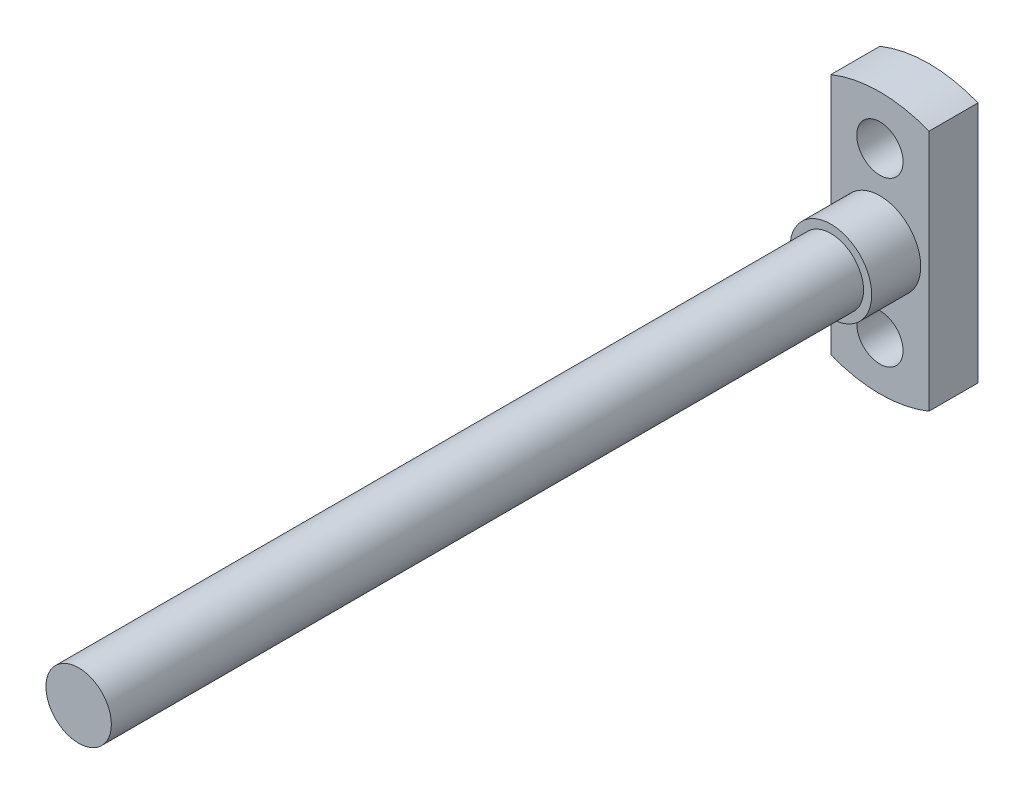
ISO-10303-21;
HEADER;
FILE_DESCRIPTION(('STEP AP214'),'2;1');
FILE_NAME('part.step','',(''),(''),'','','');
FILE_SCHEMA(('AUTOMOTIVE_DESIGN { 1 0 10303 214 1 1 1 1 }'));
ENDSEC;
DATA;
#1=APPLICATION_CONTEXT('core data for automotive mechanical design processes');
#2=APPLICATION_PROTOCOL_DEFINITION('international standard','automotive_design',2000,#1);
#3=PRODUCT_CONTEXT('',#1,'mechanical');
#4=PRODUCT('Part','Part','',(#3));
#5=PRODUCT_RELATED_PRODUCT_CATEGORY('part','',(#4));
#6=PRODUCT_DEFINITION_FORMATION('','',#4);
#7=PRODUCT_DEFINITION_CONTEXT('part definition',#1,'design');
#8=PRODUCT_DEFINITION('design','',#6,#7);
#9=PRODUCT_DEFINITION_SHAPE('','',#8);
#10=(LENGTH_UNIT() NAMED_UNIT(*) SI_UNIT(.MILLI.,.METRE.));
#11=(NAMED_UNIT(*) PLANE_ANGLE_UNIT() SI_UNIT($,.RADIAN.));
#12=(NAMED_UNIT(*) SI_UNIT($,.STERADIAN.) SOLID_ANGLE_UNIT());
#13=UNCERTAINTY_MEASURE_WITH_UNIT(LENGTH_MEASURE(1.E-05),#10,'distance_accuracy_value','');
#14=(GEOMETRIC_REPRESENTATION_CONTEXT(3) GLOBAL_UNCERTAINTY_ASSIGNED_CONTEXT((#13)) GLOBAL_UNIT_ASSIGNED_CONTEXT((#10,
#11,#12)) REPRESENTATION_CONTEXT('',''));
#15=CARTESIAN_POINT('',(0.,0.,0.));
#16=DIRECTION('',(0.,0.,1.));
#17=DIRECTION('',(1.,0.,0.));
#18=AXIS2_PLACEMENT_3D('',#15,#16,#17);
#19=CARTESIAN_POINT('',(4.7625,11.7732150982644,9.525));
#20=DIRECTION('',(0.,0.,1.));
#21=DIRECTION('',(1.,0.,0.));
#22=AXIS2_PLACEMENT_3D('',#19,#20,#21);
#23=PLANE('',#22);
#24=CARTESIAN_POINT('',(4.7625,11.7732150982644,9.525));
#25=DIRECTION('',(0.,0.,1.));
#26=DIRECTION('',(1.,0.,0.));
#27=AXIS2_PLACEMENT_3D('',#24,#25,#26);
#28=CIRCLE('',#27,3.96875);
#29=CARTESIAN_POINT('',(0.793749999999997,11.7732150982644,9.525));
#30=VERTEX_POINT('',#29);
#31=EDGE_CURVE('E104',#30,#30,#28,.T.);
#32=ORIENTED_EDGE('',*,*,#31,.T.);
#33=EDGE_LOOP('',(#32));
#34=FACE_BOUND('',#33,.T.);
#35=CARTESIAN_POINT('',(4.7625,11.7732150982644,9.525));
#36=DIRECTION('',(0.,0.,1.));
#37=DIRECTION('',(1.,0.,0.));
#38=AXIS2_PLACEMENT_3D('',#35,#36,#37);
#39=CIRCLE('',#38,3.175);
#40=CARTESIAN_POINT('',(7.9375,11.7732150982644,9.525));
#41=VERTEX_POINT('',#40);
#42=EDGE_CURVE('E170',#41,#41,#39,.T.);
#43=ORIENTED_EDGE('',*,*,#42,.F.);
#44=EDGE_LOOP('',(#43));
#45=FACE_BOUND('',#44,.T.);
#46=ADVANCED_FACE('F33',(#34,#45),#23,.T.);
#47=CARTESIAN_POINT('',(4.7625,11.7732150982644,4.7625));
#48=DIRECTION('',(0.,0.,-1.));
#49=DIRECTION('',(-1.,0.,0.));
#50=AXIS2_PLACEMENT_3D('',#47,#48,#49);
#51=PLANE('',#50);
#52=CARTESIAN_POINT('',(4.7625,3.83571509826437,4.7625));
#53=DIRECTION('',(0.,0.,1.));
#54=DIRECTION('',(1.,0.,0.));
#55=AXIS2_PLACEMENT_3D('',#52,#53,#54);
#56=CIRCLE('',#55,2.24789999999999);
#57=CARTESIAN_POINT('',(7.01039999999999,3.83571509826437,4.7625));
#58=VERTEX_POINT('',#57);
#59=EDGE_CURVE('E160',#58,#58,#56,.T.);
#60=ORIENTED_EDGE('',*,*,#59,.F.);
#61=EDGE_LOOP('',(#60));
#62=FACE_BOUND('',#61,.T.);
#63=CARTESIAN_POINT('',(4.7625,19.7107150982644,4.7625));
#64=DIRECTION('',(0.,0.,1.));
#65=DIRECTION('',(1.,0.,0.));
#66=AXIS2_PLACEMENT_3D('',#63,#64,#65);
#67=CIRCLE('',#66,2.24789999999999);
#68=CARTESIAN_POINT('',(7.01039999999999,19.7107150982644,4.7625));
#69=VERTEX_POINT('',#68);
#70=EDGE_CURVE('E162',#69,#69,#67,.T.);
#71=ORIENTED_EDGE('',*,*,#70,.F.);
#72=EDGE_LOOP('',(#71));
#73=FACE_BOUND('',#72,.T.);
#74=CARTESIAN_POINT('',(4.7625,11.7732150982644,4.7625));
#75=DIRECTION('',(0.,0.,1.));
#76=DIRECTION('',(-1.,0.,0.));
#77=AXIS2_PLACEMENT_3D('',#74,#75,#76);
#78=CIRCLE('',#77,12.7);
#79=CARTESIAN_POINT('',(0.,0.,4.7625));
#80=VERTEX_POINT('',#79);
#81=CARTESIAN_POINT('',(9.525,0.,4.7625));
#82=VERTEX_POINT('',#81);
#83=EDGE_CURVE('E87',#80,#82,#78,.T.);
#84=ORIENTED_EDGE('',*,*,#83,.T.);
#85=DIRECTION('',(0.,1.,0.));
#86=VECTOR('',#85,1.);
#87=CARTESIAN_POINT('',(9.525,0.,4.7625));
#88=LINE('',#87,#86);
#89=CARTESIAN_POINT('',(9.525,23.5464301965287,4.7625));
#90=VERTEX_POINT('',#89);
#91=EDGE_CURVE('E81',#82,#90,#88,.T.);
#92=ORIENTED_EDGE('',*,*,#91,.T.);
#93=CARTESIAN_POINT('',(4.7625,11.7732150982644,4.7625));
#94=DIRECTION('',(0.,0.,1.));
#95=DIRECTION('',(-1.,0.,0.));
#96=AXIS2_PLACEMENT_3D('',#93,#94,#95);
#97=CIRCLE('',#96,12.7);
#98=CARTESIAN_POINT('',(0.,23.5464301965287,4.7625));
#99=VERTEX_POINT('',#98);
#100=EDGE_CURVE('E85',#90,#99,#97,.T.);
#101=ORIENTED_EDGE('',*,*,#100,.T.);
#102=DIRECTION('',(0.,-1.,0.));
#103=VECTOR('',#102,1.);
#104=CARTESIAN_POINT('',(0.,0.,4.7625));
#105=LINE('',#104,#103);
#106=EDGE_CURVE('E50',#99,#80,#105,.T.);
#107=ORIENTED_EDGE('',*,*,#106,.T.);
#108=EDGE_LOOP('',(#84,#92,#101,#107));
#109=FACE_BOUND('',#108,.T.);
#110=CARTESIAN_POINT('',(4.7625,11.7732150982644,4.7625));
#111=DIRECTION('',(0.,0.,-1.));
#112=DIRECTION('',(-1.,0.,0.));
#113=AXIS2_PLACEMENT_3D('',#110,#111,#112);
#114=CIRCLE('',#113,3.96875);
#115=CARTESIAN_POINT('',(0.793749999999997,11.7732150982644,4.7625));
#116=VERTEX_POINT('',#115);
#117=EDGE_CURVE('E11',#116,#116,#114,.F.);
#118=ORIENTED_EDGE('',*,*,#117,.F.);
#119=EDGE_LOOP('',(#118));
#120=FACE_BOUND('',#119,.T.);
#121=ADVANCED_FACE('F82',(#62,#73,#109,#120),#51,.F.);
#122=CARTESIAN_POINT('',(4.7625,11.7732150982644,4.7625));
#123=DIRECTION('',(0.,0.,-1.));
#124=DIRECTION('',(-1.,0.,0.));
#125=AXIS2_PLACEMENT_3D('',#122,#123,#124);
#126=CYLINDRICAL_SURFACE('',#125,12.7);
#127=CARTESIAN_POINT('',(4.7625,11.7732150982644,0.));
#128=DIRECTION('',(0.,0.,1.));
#129=DIRECTION('',(-1.,0.,0.));
#130=AXIS2_PLACEMENT_3D('',#127,#128,#129);
#131=CIRCLE('',#130,12.7);
#132=CARTESIAN_POINT('',(0.,0.,0.));
#133=VERTEX_POINT('',#132);
#134=CARTESIAN_POINT('',(9.525,0.,0.));
#135=VERTEX_POINT('',#134);
#136=EDGE_CURVE('E101',#133,#135,#131,.T.);
#137=ORIENTED_EDGE('',*,*,#136,.T.);
#138=DIRECTION('',(0.,0.,-1.));
#139=VECTOR('',#138,1.);
#140=CARTESIAN_POINT('',(9.525,0.,4.7625));
#141=LINE('',#140,#139);
#142=EDGE_CURVE('E42',#82,#135,#141,.T.);
#143=ORIENTED_EDGE('',*,*,#142,.F.);
#144=ORIENTED_EDGE('',*,*,#83,.F.);
#145=DIRECTION('',(0.,0.,-1.));
#146=VECTOR('',#145,1.);
#147=CARTESIAN_POINT('',(0.,0.,4.7625));
#148=LINE('',#147,#146);
#149=EDGE_CURVE('E97',#80,#133,#148,.T.);
#150=ORIENTED_EDGE('',*,*,#149,.T.);
#151=EDGE_LOOP('',(#137,#143,#144,#150));
#152=FACE_BOUND('',#151,.T.);
#153=ADVANCED_FACE('F35',(#152),#126,.T.);
#154=CARTESIAN_POINT('',(9.525,0.,4.7625));
#155=DIRECTION('',(-1.,0.,0.));
#156=DIRECTION('',(0.,-1.,0.));
#157=AXIS2_PLACEMENT_3D('',#154,#155,#156);
#158=PLANE('',#157);
#159=DIRECTION('',(0.,1.,0.));
#160=VECTOR('',#159,1.);
#161=CARTESIAN_POINT('',(9.525,0.,0.));
#162=LINE('',#161,#160);
#163=CARTESIAN_POINT('',(9.525,23.5464301965287,0.));
#164=VERTEX_POINT('',#163);
#165=EDGE_CURVE('E92',#135,#164,#162,.T.);
#166=ORIENTED_EDGE('',*,*,#165,.T.);
#167=DIRECTION('',(0.,0.,-1.));
#168=VECTOR('',#167,1.);
#169=CARTESIAN_POINT('',(9.525,23.5464301965287,4.7625));
#170=LINE('',#169,#168);
#171=EDGE_CURVE('E90',#90,#164,#170,.T.);
#172=ORIENTED_EDGE('',*,*,#171,.F.);
#173=ORIENTED_EDGE('',*,*,#91,.F.);
#174=ORIENTED_EDGE('',*,*,#142,.T.);
#175=EDGE_LOOP('',(#166,#172,#173,#174));
#176=FACE_BOUND('',#175,.T.);
#177=ADVANCED_FACE('F91',(#176),#158,.F.);
#178=CARTESIAN_POINT('',(4.7625,11.7732150982644,4.7625));
#179=DIRECTION('',(0.,0.,-1.));
#180=DIRECTION('',(-1.,0.,0.));
#181=AXIS2_PLACEMENT_3D('',#178,#179,#180);
#182=CYLINDRICAL_SURFACE('',#181,12.7);
#183=CARTESIAN_POINT('',(4.7625,11.7732150982644,0.));
#184=DIRECTION('',(0.,0.,1.));
#185=DIRECTION('',(-1.,0.,0.));
#186=AXIS2_PLACEMENT_3D('',#183,#184,#185);
#187=CIRCLE('',#186,12.7);
#188=CARTESIAN_POINT('',(0.,23.5464301965287,0.));
#189=VERTEX_POINT('',#188);
#190=EDGE_CURVE('E67',#164,#189,#187,.T.);
#191=ORIENTED_EDGE('',*,*,#190,.T.);
#192=DIRECTION('',(0.,0.,-1.));
#193=VECTOR('',#192,1.);
#194=CARTESIAN_POINT('',(0.,23.5464301965287,4.7625));
#195=LINE('',#194,#193);
#196=EDGE_CURVE('E93',#99,#189,#195,.T.);
#197=ORIENTED_EDGE('',*,*,#196,.F.);
#198=ORIENTED_EDGE('',*,*,#100,.F.);
#199=ORIENTED_EDGE('',*,*,#171,.T.);
#200=EDGE_LOOP('',(#191,#197,#198,#199));
#201=FACE_BOUND('',#200,.T.);
#202=ADVANCED_FACE('F95',(#201),#182,.T.);
#203=CARTESIAN_POINT('',(0.,0.,4.7625));
#204=DIRECTION('',(1.,0.,0.));
#205=DIRECTION('',(0.,0.,-1.));
#206=AXIS2_PLACEMENT_3D('',#203,#204,#205);
#207=PLANE('',#206);
#208=DIRECTION('',(0.,-1.,0.));
#209=VECTOR('',#208,1.);
#210=CARTESIAN_POINT('',(0.,0.,0.));
#211=LINE('',#210,#209);
#212=EDGE_CURVE('E73',#189,#133,#211,.T.);
#213=ORIENTED_EDGE('',*,*,#212,.T.);
#214=ORIENTED_EDGE('',*,*,#149,.F.);
#215=ORIENTED_EDGE('',*,*,#106,.F.);
#216=ORIENTED_EDGE('',*,*,#196,.T.);
#217=EDGE_LOOP('',(#213,#214,#215,#216));
#218=FACE_BOUND('',#217,.T.);
#219=ADVANCED_FACE('F115',(#218),#207,.F.);
#220=CARTESIAN_POINT('',(4.7625,11.7732150982644,0.));
#221=DIRECTION('',(0.,0.,-1.));
#222=DIRECTION('',(-1.,0.,0.));
#223=AXIS2_PLACEMENT_3D('',#220,#221,#222);
#224=PLANE('',#223);
#225=CARTESIAN_POINT('',(4.7625,3.83571509826437,0.));
#226=DIRECTION('',(0.,0.,1.));
#227=DIRECTION('',(1.,0.,0.));
#228=AXIS2_PLACEMENT_3D('',#225,#226,#227);
#229=CIRCLE('',#228,2.2479);
#230=CARTESIAN_POINT('',(7.0104,3.83571509826437,0.));
#231=VERTEX_POINT('',#230);
#232=EDGE_CURVE('E157',#231,#231,#229,.T.);
#233=ORIENTED_EDGE('',*,*,#232,.T.);
#234=EDGE_LOOP('',(#233));
#235=FACE_BOUND('',#234,.T.);
#236=CARTESIAN_POINT('',(4.7625,19.7107150982644,0.));
#237=DIRECTION('',(0.,0.,1.));
#238=DIRECTION('',(1.,0.,0.));
#239=AXIS2_PLACEMENT_3D('',#236,#237,#238);
#240=CIRCLE('',#239,2.2479);
#241=CARTESIAN_POINT('',(7.0104,19.7107150982644,0.));
#242=VERTEX_POINT('',#241);
#243=EDGE_CURVE('E167',#242,#242,#240,.T.);
#244=ORIENTED_EDGE('',*,*,#243,.T.);
#245=EDGE_LOOP('',(#244));
#246=FACE_BOUND('',#245,.T.);
#247=ORIENTED_EDGE('',*,*,#136,.F.);
#248=ORIENTED_EDGE('',*,*,#212,.F.);
#249=ORIENTED_EDGE('',*,*,#190,.F.);
#250=ORIENTED_EDGE('',*,*,#165,.F.);
#251=EDGE_LOOP('',(#247,#248,#249,#250));
#252=FACE_BOUND('',#251,.T.);
#253=ADVANCED_FACE('F112',(#235,#246,#252),#224,.T.);
#254=CARTESIAN_POINT('',(4.7625,11.7732150982644,9.525));
#255=DIRECTION('',(0.,0.,-1.));
#256=DIRECTION('',(-1.,0.,0.));
#257=AXIS2_PLACEMENT_3D('',#254,#255,#256);
#258=CYLINDRICAL_SURFACE('',#257,3.96875);
#259=CARTESIAN_POINT('',(0.793749999999997,11.7732150982644,9.525));
#260=CARTESIAN_POINT('',(0.793749999999997,11.7732150982644,9.475390625));
#261=CARTESIAN_POINT('',(0.793749999999997,11.7732150982644,9.42578125));
#262=CARTESIAN_POINT('',(0.793749999999997,11.7732150982644,9.3265625));
#263=CARTESIAN_POINT('',(0.793749999999997,11.7732150982644,9.276953125));
#264=CARTESIAN_POINT('',(0.793749999999997,11.7732150982644,9.177734375));
#265=CARTESIAN_POINT('',(0.793749999999997,11.7732150982644,9.128125));
#266=CARTESIAN_POINT('',(0.793749999999997,11.7732150982644,9.02890625));
#267=CARTESIAN_POINT('',(0.793749999999997,11.7732150982644,8.979296875));
#268=CARTESIAN_POINT('',(0.793749999999997,11.7732150982644,8.880078125));
#269=CARTESIAN_POINT('',(0.793749999999997,11.7732150982644,8.83046875));
#270=CARTESIAN_POINT('',(0.793749999999997,11.7732150982644,8.73125));
#271=CARTESIAN_POINT('',(0.793749999999997,11.7732150982644,8.681640625));
#272=CARTESIAN_POINT('',(0.793749999999997,11.7732150982644,8.582421875));
#273=CARTESIAN_POINT('',(0.793749999999997,11.7732150982644,8.5328125));
#274=CARTESIAN_POINT('',(0.793749999999997,11.7732150982644,8.43359375));
#275=CARTESIAN_POINT('',(0.793749999999997,11.7732150982644,8.383984375));
#276=CARTESIAN_POINT('',(0.793749999999997,11.7732150982644,8.284765625));
#277=CARTESIAN_POINT('',(0.793749999999997,11.7732150982644,8.23515625));
#278=CARTESIAN_POINT('',(0.793749999999997,11.7732150982644,8.1359375));
#279=CARTESIAN_POINT('',(0.793749999999997,11.7732150982644,8.086328125));
#280=CARTESIAN_POINT('',(0.793749999999997,11.7732150982644,7.987109375));
#281=CARTESIAN_POINT('',(0.793749999999997,11.7732150982644,7.9375));
#282=CARTESIAN_POINT('',(0.793749999999997,11.7732150982644,7.83828125));
#283=CARTESIAN_POINT('',(0.793749999999997,11.7732150982644,7.788671875));
#284=CARTESIAN_POINT('',(0.793749999999997,11.7732150982644,7.689453125));
#285=CARTESIAN_POINT('',(0.793749999999997,11.7732150982644,7.63984375));
#286=CARTESIAN_POINT('',(0.793749999999997,11.7732150982644,7.540625));
#287=CARTESIAN_POINT('',(0.793749999999997,11.7732150982644,7.491015625));
#288=CARTESIAN_POINT('',(0.793749999999997,11.7732150982644,7.391796875));
#289=CARTESIAN_POINT('',(0.793749999999997,11.7732150982644,7.3421875));
#290=CARTESIAN_POINT('',(0.793749999999997,11.7732150982644,7.24296875));
#291=CARTESIAN_POINT('',(0.793749999999997,11.7732150982644,7.193359375));
#292=CARTESIAN_POINT('',(0.793749999999997,11.7732150982644,7.094140625));
#293=CARTESIAN_POINT('',(0.793749999999997,11.7732150982644,7.04453125));
#294=CARTESIAN_POINT('',(0.793749999999997,11.7732150982644,6.9453125));
#295=CARTESIAN_POINT('',(0.793749999999997,11.7732150982644,6.895703125));
#296=CARTESIAN_POINT('',(0.793749999999997,11.7732150982644,6.796484375));
#297=CARTESIAN_POINT('',(0.793749999999997,11.7732150982644,6.746875));
#298=CARTESIAN_POINT('',(0.793749999999997,11.7732150982644,6.64765625));
#299=CARTESIAN_POINT('',(0.793749999999997,11.7732150982644,6.598046875));
#300=CARTESIAN_POINT('',(0.793749999999997,11.7732150982644,6.498828125));
#301=CARTESIAN_POINT('',(0.793749999999997,11.7732150982644,6.44921875));
#302=CARTESIAN_POINT('',(0.793749999999997,11.7732150982644,6.35));
#303=CARTESIAN_POINT('',(0.793749999999997,11.7732150982644,6.300390625));
#304=CARTESIAN_POINT('',(0.793749999999997,11.7732150982644,6.201171875));
#305=CARTESIAN_POINT('',(0.793749999999997,11.7732150982644,6.1515625));
#306=CARTESIAN_POINT('',(0.793749999999997,11.7732150982644,6.05234375));
#307=CARTESIAN_POINT('',(0.793749999999997,11.7732150982644,6.002734375));
#308=CARTESIAN_POINT('',(0.793749999999997,11.7732150982644,5.903515625));
#309=CARTESIAN_POINT('',(0.793749999999997,11.7732150982644,5.85390625));
#310=CARTESIAN_POINT('',(0.793749999999997,11.7732150982644,5.7546875));
#311=CARTESIAN_POINT('',(0.793749999999997,11.7732150982644,5.705078125));
#312=CARTESIAN_POINT('',(0.793749999999997,11.7732150982644,5.605859375));
#313=CARTESIAN_POINT('',(0.793749999999997,11.7732150982644,5.55625));
#314=CARTESIAN_POINT('',(0.793749999999997,11.7732150982644,5.45703125));
#315=CARTESIAN_POINT('',(0.793749999999997,11.7732150982644,5.407421875));
#316=CARTESIAN_POINT('',(0.793749999999997,11.7732150982644,5.308203125));
#317=CARTESIAN_POINT('',(0.793749999999997,11.7732150982644,5.25859375));
#318=CARTESIAN_POINT('',(0.793749999999997,11.7732150982644,5.159375));
#319=CARTESIAN_POINT('',(0.793749999999997,11.7732150982644,5.109765625));
#320=CARTESIAN_POINT('',(0.793749999999997,11.7732150982644,5.010546875));
#321=CARTESIAN_POINT('',(0.793749999999997,11.7732150982644,4.9609375));
#322=CARTESIAN_POINT('',(0.793749999999997,11.7732150982644,4.86171875));
#323=CARTESIAN_POINT('',(0.793749999999997,11.7732150982644,4.812109375));
#324=CARTESIAN_POINT('',(0.793749999999997,11.7732150982644,4.7625));
#325=B_SPLINE_CURVE_WITH_KNOTS('',3,(#259,#260,#261,#262,#263,#264,#265,#266,#267,#268,#269,
#270,#271,#272,#273,#274,#275,#276,#277,#278,#279,#280,#281,#282,#283,#284,#285,#286,#287,#288,
#289,#290,#291,#292,#293,#294,#295,#296,#297,#298,#299,#300,#301,#302,#303,#304,#305,#306,#307,
#308,#309,#310,#311,#312,#313,#314,#315,#316,#317,#318,#319,#320,#321,#322,#323,#324),
.UNSPECIFIED.,.F.,.F.,(4,2,2,2,2,2,2,2,2,2,2,2,2,2,2,2,2,2,2,2,2,2,2,2,2,2,2,2,2,2,2,2,4),(0.,
0.148828124999998,0.297656249999998,0.446484374999999,0.595312499999999,0.744140624999999,
0.892968749999999,1.041796875,1.190625,1.339453125,1.48828125,1.637109375,1.7859375,1.934765625,
2.08359375,2.232421875,2.38125,2.530078125,2.67890625,2.827734375,2.9765625,3.125390625,
3.27421875,3.423046875,3.571875,3.720703125,3.86953125,4.018359375,4.1671875,4.316015625,
4.46484375,4.613671875,4.7625),.UNSPECIFIED.);
#326=EDGE_CURVE('BSEAM114',#30,#116,#325,.T.);
#327=ORIENTED_EDGE('',*,*,#31,.F.);
#328=ORIENTED_EDGE('',*,*,#117,.T.);
#329=ORIENTED_EDGE('',*,*,#326,.T.);
#330=ORIENTED_EDGE('',*,*,#326,.F.);
#331=EDGE_LOOP('',(#327,#329,#328,#330));
#332=FACE_BOUND('',#331,.T.);
#333=ADVANCED_FACE('F114',(#332),#258,.T.);
#334=CARTESIAN_POINT('',(4.7625,11.7732150982644,82.55));
#335=DIRECTION('',(0.,0.,-1.));
#336=DIRECTION('',(-1.,0.,0.));
#337=AXIS2_PLACEMENT_3D('',#334,#335,#336);
#338=CYLINDRICAL_SURFACE('',#337,3.175);
#339=CARTESIAN_POINT('',(4.7625,11.7732150982644,82.55));
#340=DIRECTION('',(0.,0.,1.));
#341=DIRECTION('',(1.,0.,0.));
#342=AXIS2_PLACEMENT_3D('',#339,#340,#341);
#343=CIRCLE('',#342,3.175);
#344=CARTESIAN_POINT('',(7.9375,11.7732150982644,82.55));
#345=VERTEX_POINT('',#344);
#346=EDGE_CURVE('E171',#345,#345,#343,.T.);
#347=ORIENTED_EDGE('',*,*,#346,.F.);
#348=EDGE_LOOP('',(#347));
#349=FACE_BOUND('',#348,.T.);
#350=ORIENTED_EDGE('',*,*,#42,.T.);
#351=EDGE_LOOP('',(#350));
#352=FACE_BOUND('',#351,.T.);
#353=ADVANCED_FACE('F122',(#349,#352),#338,.T.);
#354=CARTESIAN_POINT('',(4.7625,11.7732150982644,82.55));
#355=DIRECTION('',(0.,0.,1.));
#356=DIRECTION('',(1.,0.,0.));
#357=AXIS2_PLACEMENT_3D('',#354,#355,#356);
#358=PLANE('',#357);
#359=ORIENTED_EDGE('',*,*,#346,.T.);
#360=EDGE_LOOP('',(#359));
#361=FACE_BOUND('',#360,.T.);
#362=ADVANCED_FACE('F141',(#361),#358,.T.);
#363=CARTESIAN_POINT('',(4.7625,19.7107150982644,4.7625));
#364=DIRECTION('',(0.,0.,1.));
#365=DIRECTION('',(1.,0.,0.));
#366=AXIS2_PLACEMENT_3D('',#363,#364,#365);
#367=CYLINDRICAL_SURFACE('',#366,2.24789999999999);
#368=ORIENTED_EDGE('',*,*,#243,.F.);
#369=EDGE_LOOP('',(#368));
#370=FACE_BOUND('',#369,.T.);
#371=ORIENTED_EDGE('',*,*,#70,.T.);
#372=EDGE_LOOP('',(#371));
#373=FACE_BOUND('',#372,.T.);
#374=ADVANCED_FACE('F145',(#370,#373),#367,.F.);
#375=CARTESIAN_POINT('',(4.7625,3.83571509826437,4.7625));
#376=DIRECTION('',(0.,0.,1.));
#377=DIRECTION('',(1.,0.,0.));
#378=AXIS2_PLACEMENT_3D('',#375,#376,#377);
#379=CYLINDRICAL_SURFACE('',#378,2.24789999999999);
#380=ORIENTED_EDGE('',*,*,#232,.F.);
#381=EDGE_LOOP('',(#380));
#382=FACE_BOUND('',#381,.T.);
#383=ORIENTED_EDGE('',*,*,#59,.T.);
#384=EDGE_LOOP('',(#383));
#385=FACE_BOUND('',#384,.T.);
#386=ADVANCED_FACE('F149',(#382,#385),#379,.F.);
#387=CLOSED_SHELL('',(#46,#121,#153,#177,#202,#219,#253,#333,#353,#362,#374,#386));
#388=MANIFOLD_SOLID_BREP('B2',#387);
#389=ADVANCED_BREP_SHAPE_REPRESENTATION('',(#18,#388),#14);
#390=SHAPE_DEFINITION_REPRESENTATION(#9,#389);
ENDSEC;
END-ISO-10303-21;
